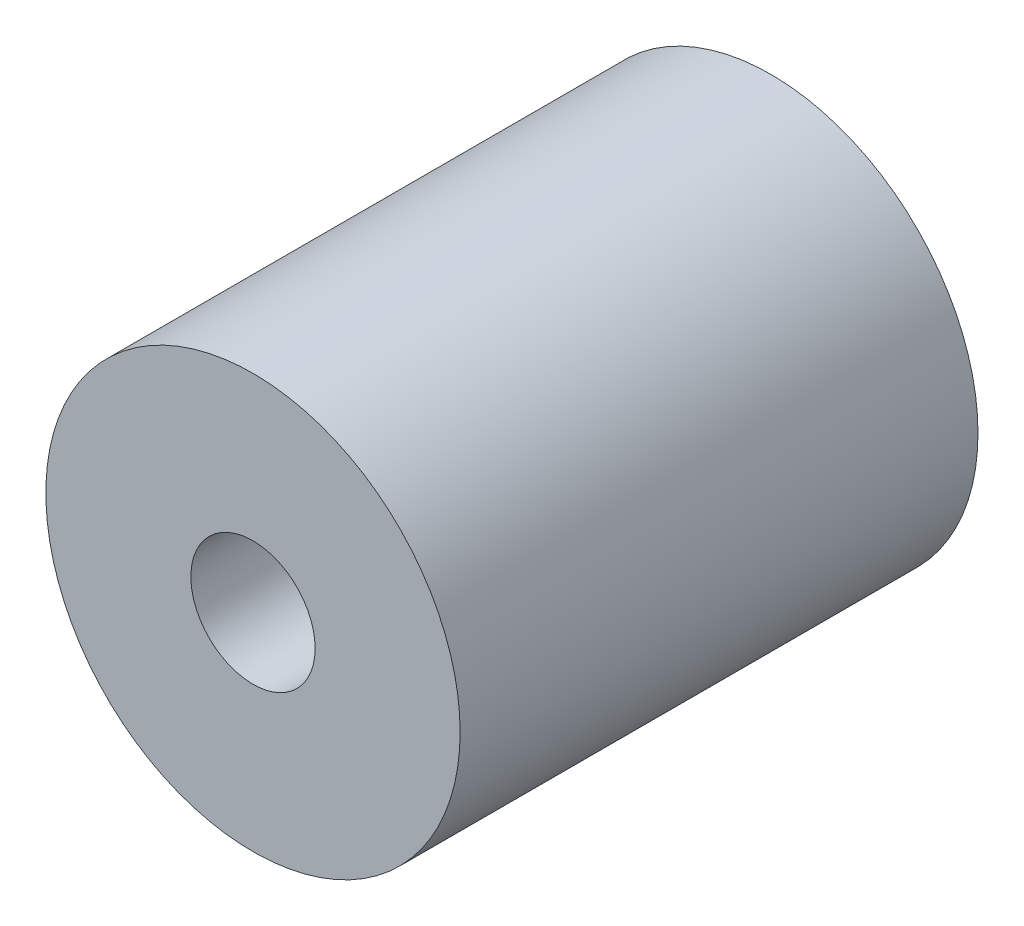
ISO-10303-21;
HEADER;
FILE_DESCRIPTION(('STEP AP214'),'2;1');
FILE_NAME('part.step','',(''),(''),'','','');
FILE_SCHEMA(('AUTOMOTIVE_DESIGN { 1 0 10303 214 1 1 1 1 }'));
ENDSEC;
DATA;
#1=APPLICATION_CONTEXT('core data for automotive mechanical design processes');
#2=APPLICATION_PROTOCOL_DEFINITION('international standard','automotive_design',2000,#1);
#3=PRODUCT_CONTEXT('',#1,'mechanical');
#4=PRODUCT('Part','Part','',(#3));
#5=PRODUCT_RELATED_PRODUCT_CATEGORY('part','',(#4));
#6=PRODUCT_DEFINITION_FORMATION('','',#4);
#7=PRODUCT_DEFINITION_CONTEXT('part definition',#1,'design');
#8=PRODUCT_DEFINITION('design','',#6,#7);
#9=PRODUCT_DEFINITION_SHAPE('','',#8);
#10=(LENGTH_UNIT() NAMED_UNIT(*) SI_UNIT(.MILLI.,.METRE.));
#11=(NAMED_UNIT(*) PLANE_ANGLE_UNIT() SI_UNIT($,.RADIAN.));
#12=(NAMED_UNIT(*) SI_UNIT($,.STERADIAN.) SOLID_ANGLE_UNIT());
#13=UNCERTAINTY_MEASURE_WITH_UNIT(LENGTH_MEASURE(1.E-05),#10,'distance_accuracy_value','');
#14=(GEOMETRIC_REPRESENTATION_CONTEXT(3) GLOBAL_UNCERTAINTY_ASSIGNED_CONTEXT((#13)) GLOBAL_UNIT_ASSIGNED_CONTEXT((#10,
#11,#12)) REPRESENTATION_CONTEXT('',''));
#15=CARTESIAN_POINT('',(0.,0.,0.));
#16=DIRECTION('',(0.,0.,1.));
#17=DIRECTION('',(1.,0.,0.));
#18=AXIS2_PLACEMENT_3D('',#15,#16,#17);
#19=CARTESIAN_POINT('',(0.,0.,25.));
#20=DIRECTION('',(0.,0.,-1.));
#21=DIRECTION('',(-1.,0.,0.));
#22=AXIS2_PLACEMENT_3D('',#19,#20,#21);
#23=CYLINDRICAL_SURFACE('',#22,10.);
#24=CARTESIAN_POINT('',(0.,0.,25.));
#25=DIRECTION('',(0.,0.,1.));
#26=DIRECTION('',(1.,0.,0.));
#27=AXIS2_PLACEMENT_3D('',#24,#25,#26);
#28=CIRCLE('',#27,10.);
#29=CARTESIAN_POINT('',(10.,0.,25.));
#30=VERTEX_POINT('',#29);
#31=EDGE_CURVE('E10',#30,#30,#28,.T.);
#32=ORIENTED_EDGE('',*,*,#31,.F.);
#33=EDGE_LOOP('',(#32));
#34=FACE_BOUND('',#33,.T.);
#35=CARTESIAN_POINT('',(0.,0.,0.));
#36=DIRECTION('',(0.,0.,1.));
#37=DIRECTION('',(1.,0.,0.));
#38=AXIS2_PLACEMENT_3D('',#35,#36,#37);
#39=CIRCLE('',#38,10.);
#40=CARTESIAN_POINT('',(10.,0.,0.));
#41=VERTEX_POINT('',#40);
#42=EDGE_CURVE('E33',#41,#41,#39,.T.);
#43=ORIENTED_EDGE('',*,*,#42,.T.);
#44=EDGE_LOOP('',(#43));
#45=FACE_BOUND('',#44,.T.);
#46=ADVANCED_FACE('F30',(#34,#45),#23,.T.);
#47=CARTESIAN_POINT('',(0.,0.,25.));
#48=DIRECTION('',(0.,0.,1.));
#49=DIRECTION('',(1.,0.,0.));
#50=AXIS2_PLACEMENT_3D('',#47,#48,#49);
#51=PLANE('',#50);
#52=CARTESIAN_POINT('',(0.,0.,25.));
#53=DIRECTION('',(0.,0.,1.));
#54=DIRECTION('',(1.,0.,0.));
#55=AXIS2_PLACEMENT_3D('',#52,#53,#54);
#56=CIRCLE('',#55,3.);
#57=CARTESIAN_POINT('',(3.,0.,25.));
#58=VERTEX_POINT('',#57);
#59=EDGE_CURVE('E42',#58,#58,#56,.T.);
#60=ORIENTED_EDGE('',*,*,#59,.F.);
#61=EDGE_LOOP('',(#60));
#62=FACE_BOUND('',#61,.T.);
#63=ORIENTED_EDGE('',*,*,#31,.T.);
#64=EDGE_LOOP('',(#63));
#65=FACE_BOUND('',#64,.T.);
#66=ADVANCED_FACE('F67',(#62,#65),#51,.T.);
#67=CARTESIAN_POINT('',(0.,0.,0.));
#68=DIRECTION('',(0.,0.,1.));
#69=DIRECTION('',(1.,0.,0.));
#70=AXIS2_PLACEMENT_3D('',#67,#68,#69);
#71=PLANE('',#70);
#72=CARTESIAN_POINT('',(0.,0.,0.));
#73=DIRECTION('',(0.,0.,-1.));
#74=DIRECTION('',(-1.,0.,0.));
#75=AXIS2_PLACEMENT_3D('',#72,#73,#74);
#76=CIRCLE('',#75,4.);
#77=CARTESIAN_POINT('',(-4.,0.,0.));
#78=VERTEX_POINT('',#77);
#79=EDGE_CURVE('E48',#78,#78,#76,.T.);
#80=ORIENTED_EDGE('',*,*,#79,.F.);
#81=EDGE_LOOP('',(#80));
#82=FACE_BOUND('',#81,.T.);
#83=ORIENTED_EDGE('',*,*,#42,.F.);
#84=EDGE_LOOP('',(#83));
#85=FACE_BOUND('',#84,.T.);
#86=ADVANCED_FACE('F63',(#82,#85),#71,.F.);
#87=CARTESIAN_POINT('',(0.,0.,13.));
#88=DIRECTION('',(0.,0.,1.));
#89=DIRECTION('',(1.,0.,0.));
#90=AXIS2_PLACEMENT_3D('',#87,#88,#89);
#91=CYLINDRICAL_SURFACE('',#90,3.);
#92=CARTESIAN_POINT('',(0.,0.,13.));
#93=DIRECTION('',(0.,0.,1.));
#94=DIRECTION('',(1.,0.,0.));
#95=AXIS2_PLACEMENT_3D('',#92,#93,#94);
#96=CIRCLE('',#95,3.);
#97=CARTESIAN_POINT('',(3.,0.,13.));
#98=VERTEX_POINT('',#97);
#99=EDGE_CURVE('E40',#98,#98,#96,.T.);
#100=ORIENTED_EDGE('',*,*,#99,.F.);
#101=EDGE_LOOP('',(#100));
#102=FACE_BOUND('',#101,.T.);
#103=ORIENTED_EDGE('',*,*,#59,.T.);
#104=EDGE_LOOP('',(#103));
#105=FACE_BOUND('',#104,.T.);
#106=ADVANCED_FACE('F66',(#102,#105),#91,.F.);
#107=CARTESIAN_POINT('',(0.,0.,13.));
#108=DIRECTION('',(0.,0.,1.));
#109=DIRECTION('',(1.,0.,0.));
#110=AXIS2_PLACEMENT_3D('',#107,#108,#109);
#111=PLANE('',#110);
#112=ORIENTED_EDGE('',*,*,#99,.T.);
#113=EDGE_LOOP('',(#112));
#114=FACE_BOUND('',#113,.T.);
#115=ADVANCED_FACE('F59',(#114),#111,.T.);
#116=CARTESIAN_POINT('',(0.,0.,12.));
#117=DIRECTION('',(0.,0.,-1.));
#118=DIRECTION('',(-1.,0.,0.));
#119=AXIS2_PLACEMENT_3D('',#116,#117,#118);
#120=CYLINDRICAL_SURFACE('',#119,4.);
#121=CARTESIAN_POINT('',(0.,0.,12.));
#122=DIRECTION('',(0.,0.,-1.));
#123=DIRECTION('',(-1.,0.,0.));
#124=AXIS2_PLACEMENT_3D('',#121,#122,#123);
#125=CIRCLE('',#124,4.);
#126=CARTESIAN_POINT('',(-4.,0.,12.));
#127=VERTEX_POINT('',#126);
#128=EDGE_CURVE('E45',#127,#127,#125,.T.);
#129=ORIENTED_EDGE('',*,*,#128,.F.);
#130=EDGE_LOOP('',(#129));
#131=FACE_BOUND('',#130,.T.);
#132=ORIENTED_EDGE('',*,*,#79,.T.);
#133=EDGE_LOOP('',(#132));
#134=FACE_BOUND('',#133,.T.);
#135=ADVANCED_FACE('F56',(#131,#134),#120,.F.);
#136=CARTESIAN_POINT('',(0.,0.,12.));
#137=DIRECTION('',(0.,0.,-1.));
#138=DIRECTION('',(-1.,0.,0.));
#139=AXIS2_PLACEMENT_3D('',#136,#137,#138);
#140=PLANE('',#139);
#141=ORIENTED_EDGE('',*,*,#128,.T.);
#142=EDGE_LOOP('',(#141));
#143=FACE_BOUND('',#142,.T.);
#144=ADVANCED_FACE('F54',(#143),#140,.T.);
#145=CLOSED_SHELL('',(#46,#66,#86,#106,#115,#135,#144));
#146=MANIFOLD_SOLID_BREP('B2',#145);
#147=ADVANCED_BREP_SHAPE_REPRESENTATION('',(#18,#146),#14);
#148=SHAPE_DEFINITION_REPRESENTATION(#9,#147);
ENDSEC;
END-ISO-10303-21;
